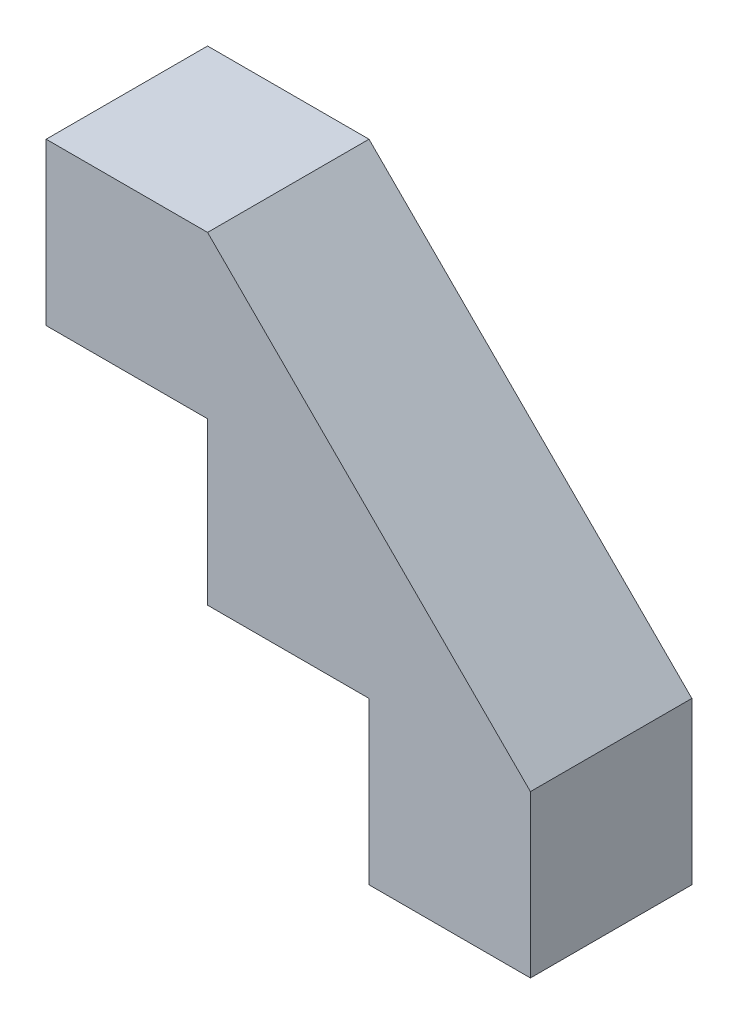
ISO-10303-21;
HEADER;
FILE_DESCRIPTION(('STEP AP214'),'2;1');
FILE_NAME('part.step','',(''),(''),'','','');
FILE_SCHEMA(('AUTOMOTIVE_DESIGN { 1 0 10303 214 1 1 1 1 }'));
ENDSEC;
DATA;
#1=APPLICATION_CONTEXT('core data for automotive mechanical design processes');
#2=APPLICATION_PROTOCOL_DEFINITION('international standard','automotive_design',2000,#1);
#3=PRODUCT_CONTEXT('',#1,'mechanical');
#4=PRODUCT('Part','Part','',(#3));
#5=PRODUCT_RELATED_PRODUCT_CATEGORY('part','',(#4));
#6=PRODUCT_DEFINITION_FORMATION('','',#4);
#7=PRODUCT_DEFINITION_CONTEXT('part definition',#1,'design');
#8=PRODUCT_DEFINITION('design','',#6,#7);
#9=PRODUCT_DEFINITION_SHAPE('','',#8);
#10=(LENGTH_UNIT() NAMED_UNIT(*) SI_UNIT(.MILLI.,.METRE.));
#11=(NAMED_UNIT(*) PLANE_ANGLE_UNIT() SI_UNIT($,.RADIAN.));
#12=(NAMED_UNIT(*) SI_UNIT($,.STERADIAN.) SOLID_ANGLE_UNIT());
#13=UNCERTAINTY_MEASURE_WITH_UNIT(LENGTH_MEASURE(1.E-05),#10,'distance_accuracy_value','');
#14=(GEOMETRIC_REPRESENTATION_CONTEXT(3) GLOBAL_UNCERTAINTY_ASSIGNED_CONTEXT((#13)) GLOBAL_UNIT_ASSIGNED_CONTEXT((#10,
#11,#12)) REPRESENTATION_CONTEXT('',''));
#15=CARTESIAN_POINT('',(0.,0.,0.));
#16=DIRECTION('',(0.,0.,1.));
#17=DIRECTION('',(1.,0.,0.));
#18=AXIS2_PLACEMENT_3D('',#15,#16,#17);
#19=CARTESIAN_POINT('',(0.,0.,3.));
#20=DIRECTION('',(0.,1.,0.));
#21=DIRECTION('',(-1.,0.,0.));
#22=AXIS2_PLACEMENT_3D('',#19,#20,#21);
#23=PLANE('',#22);
#24=DIRECTION('',(1.,0.,0.));
#25=VECTOR('',#24,1.);
#26=CARTESIAN_POINT('',(0.,0.,0.));
#27=LINE('',#26,#25);
#28=CARTESIAN_POINT('',(0.,0.,0.));
#29=VERTEX_POINT('',#28);
#30=CARTESIAN_POINT('',(3.,0.,0.));
#31=VERTEX_POINT('',#30);
#32=EDGE_CURVE('E134',#29,#31,#27,.T.);
#33=ORIENTED_EDGE('',*,*,#32,.T.);
#34=DIRECTION('',(0.,0.,-1.));
#35=VECTOR('',#34,1.);
#36=CARTESIAN_POINT('',(3.,0.,3.));
#37=LINE('',#36,#35);
#38=CARTESIAN_POINT('',(3.,0.,3.));
#39=VERTEX_POINT('',#38);
#40=EDGE_CURVE('E11',#39,#31,#37,.T.);
#41=ORIENTED_EDGE('',*,*,#40,.F.);
#42=DIRECTION('',(1.,0.,0.));
#43=VECTOR('',#42,1.);
#44=CARTESIAN_POINT('',(0.,0.,3.));
#45=LINE('',#44,#43);
#46=CARTESIAN_POINT('',(0.,0.,3.));
#47=VERTEX_POINT('',#46);
#48=EDGE_CURVE('E150',#47,#39,#45,.T.);
#49=ORIENTED_EDGE('',*,*,#48,.F.);
#50=DIRECTION('',(0.,0.,-1.));
#51=VECTOR('',#50,1.);
#52=CARTESIAN_POINT('',(0.,0.,3.));
#53=LINE('',#52,#51);
#54=EDGE_CURVE('E130',#47,#29,#53,.T.);
#55=ORIENTED_EDGE('',*,*,#54,.T.);
#56=EDGE_LOOP('',(#33,#41,#49,#55));
#57=FACE_BOUND('',#56,.T.);
#58=ADVANCED_FACE('F32',(#57),#23,.F.);
#59=CARTESIAN_POINT('',(3.,-3.,3.));
#60=DIRECTION('',(1.,0.,0.));
#61=DIRECTION('',(0.,0.,-1.));
#62=AXIS2_PLACEMENT_3D('',#59,#60,#61);
#63=PLANE('',#62);
#64=DIRECTION('',(0.,-1.,0.));
#65=VECTOR('',#64,1.);
#66=CARTESIAN_POINT('',(3.,-3.,0.));
#67=LINE('',#66,#65);
#68=CARTESIAN_POINT('',(3.,-3.,0.));
#69=VERTEX_POINT('',#68);
#70=EDGE_CURVE('E137',#31,#69,#67,.T.);
#71=ORIENTED_EDGE('',*,*,#70,.T.);
#72=DIRECTION('',(0.,0.,-1.));
#73=VECTOR('',#72,1.);
#74=CARTESIAN_POINT('',(3.,-3.,3.));
#75=LINE('',#74,#73);
#76=CARTESIAN_POINT('',(3.,-3.,3.));
#77=VERTEX_POINT('',#76);
#78=EDGE_CURVE('E40',#77,#69,#75,.T.);
#79=ORIENTED_EDGE('',*,*,#78,.F.);
#80=DIRECTION('',(0.,-1.,0.));
#81=VECTOR('',#80,1.);
#82=CARTESIAN_POINT('',(3.,-3.,3.));
#83=LINE('',#82,#81);
#84=EDGE_CURVE('E94',#39,#77,#83,.T.);
#85=ORIENTED_EDGE('',*,*,#84,.F.);
#86=ORIENTED_EDGE('',*,*,#40,.T.);
#87=EDGE_LOOP('',(#71,#79,#85,#86));
#88=FACE_BOUND('',#87,.T.);
#89=ADVANCED_FACE('F193',(#88),#63,.F.);
#90=CARTESIAN_POINT('',(6.,-3.,3.));
#91=DIRECTION('',(0.,1.,0.));
#92=DIRECTION('',(-1.,0.,0.));
#93=AXIS2_PLACEMENT_3D('',#90,#91,#92);
#94=PLANE('',#93);
#95=DIRECTION('',(1.,0.,0.));
#96=VECTOR('',#95,1.);
#97=CARTESIAN_POINT('',(6.,-3.,0.));
#98=LINE('',#97,#96);
#99=CARTESIAN_POINT('',(6.,-3.,0.));
#100=VERTEX_POINT('',#99);
#101=EDGE_CURVE('E139',#69,#100,#98,.T.);
#102=ORIENTED_EDGE('',*,*,#101,.T.);
#103=DIRECTION('',(0.,0.,-1.));
#104=VECTOR('',#103,1.);
#105=CARTESIAN_POINT('',(6.,-3.,3.));
#106=LINE('',#105,#104);
#107=CARTESIAN_POINT('',(6.,-3.,3.));
#108=VERTEX_POINT('',#107);
#109=EDGE_CURVE('E160',#108,#100,#106,.T.);
#110=ORIENTED_EDGE('',*,*,#109,.F.);
#111=DIRECTION('',(1.,0.,0.));
#112=VECTOR('',#111,1.);
#113=CARTESIAN_POINT('',(6.,-3.,3.));
#114=LINE('',#113,#112);
#115=EDGE_CURVE('E168',#77,#108,#114,.T.);
#116=ORIENTED_EDGE('',*,*,#115,.F.);
#117=ORIENTED_EDGE('',*,*,#78,.T.);
#118=EDGE_LOOP('',(#102,#110,#116,#117));
#119=FACE_BOUND('',#118,.T.);
#120=ADVANCED_FACE('F166',(#119),#94,.F.);
#121=CARTESIAN_POINT('',(6.,0.,3.));
#122=DIRECTION('',(-1.,0.,0.));
#123=DIRECTION('',(0.,-1.,0.));
#124=AXIS2_PLACEMENT_3D('',#121,#122,#123);
#125=PLANE('',#124);
#126=DIRECTION('',(0.,1.,0.));
#127=VECTOR('',#126,1.);
#128=CARTESIAN_POINT('',(6.,0.,0.));
#129=LINE('',#128,#127);
#130=CARTESIAN_POINT('',(6.,0.,0.));
#131=VERTEX_POINT('',#130);
#132=EDGE_CURVE('E141',#100,#131,#129,.T.);
#133=ORIENTED_EDGE('',*,*,#132,.T.);
#134=DIRECTION('',(0.,0.,-1.));
#135=VECTOR('',#134,1.);
#136=CARTESIAN_POINT('',(6.,0.,3.));
#137=LINE('',#136,#135);
#138=CARTESIAN_POINT('',(6.,0.,3.));
#139=VERTEX_POINT('',#138);
#140=EDGE_CURVE('E157',#139,#131,#137,.T.);
#141=ORIENTED_EDGE('',*,*,#140,.F.);
#142=DIRECTION('',(0.,1.,0.));
#143=VECTOR('',#142,1.);
#144=CARTESIAN_POINT('',(6.,0.,3.));
#145=LINE('',#144,#143);
#146=EDGE_CURVE('E184',#108,#139,#145,.T.);
#147=ORIENTED_EDGE('',*,*,#146,.F.);
#148=ORIENTED_EDGE('',*,*,#109,.T.);
#149=EDGE_LOOP('',(#133,#141,#147,#148));
#150=FACE_BOUND('',#149,.T.);
#151=ADVANCED_FACE('F177',(#150),#125,.F.);
#152=CARTESIAN_POINT('',(0.,6.,3.));
#153=DIRECTION('',(-0.70710678118655,-0.707106781186544,0.));
#154=DIRECTION('',(0.707106781186545,-0.707106781186551,0.));
#155=AXIS2_PLACEMENT_3D('',#152,#153,#154);
#156=PLANE('',#155);
#157=DIRECTION('',(-0.707106781186544,0.707106781186551,0.));
#158=VECTOR('',#157,1.);
#159=CARTESIAN_POINT('',(0.,6.,0.));
#160=LINE('',#159,#158);
#161=CARTESIAN_POINT('',(0.,6.,0.));
#162=VERTEX_POINT('',#161);
#163=EDGE_CURVE('E143',#131,#162,#160,.T.);
#164=ORIENTED_EDGE('',*,*,#163,.T.);
#165=DIRECTION('',(0.,0.,-1.));
#166=VECTOR('',#165,1.);
#167=CARTESIAN_POINT('',(0.,6.,3.));
#168=LINE('',#167,#166);
#169=CARTESIAN_POINT('',(0.,6.,3.));
#170=VERTEX_POINT('',#169);
#171=EDGE_CURVE('E154',#170,#162,#168,.T.);
#172=ORIENTED_EDGE('',*,*,#171,.F.);
#173=DIRECTION('',(-0.707106781186544,0.707106781186551,0.));
#174=VECTOR('',#173,1.);
#175=CARTESIAN_POINT('',(0.,6.,3.));
#176=LINE('',#175,#174);
#177=EDGE_CURVE('E183',#139,#170,#176,.T.);
#178=ORIENTED_EDGE('',*,*,#177,.F.);
#179=ORIENTED_EDGE('',*,*,#140,.T.);
#180=EDGE_LOOP('',(#164,#172,#178,#179));
#181=FACE_BOUND('',#180,.T.);
#182=ADVANCED_FACE('F181',(#181),#156,.F.);
#183=CARTESIAN_POINT('',(0.,6.,3.));
#184=DIRECTION('',(0.,-1.,0.));
#185=DIRECTION('',(1.,0.,0.));
#186=AXIS2_PLACEMENT_3D('',#183,#184,#185);
#187=PLANE('',#186);
#188=DIRECTION('',(-1.,0.,0.));
#189=VECTOR('',#188,1.);
#190=CARTESIAN_POINT('',(0.,6.,0.));
#191=LINE('',#190,#189);
#192=CARTESIAN_POINT('',(-3.,6.,0.));
#193=VERTEX_POINT('',#192);
#194=EDGE_CURVE('E145',#162,#193,#191,.T.);
#195=ORIENTED_EDGE('',*,*,#194,.T.);
#196=DIRECTION('',(0.,0.,-1.));
#197=VECTOR('',#196,1.);
#198=CARTESIAN_POINT('',(-3.,6.,3.));
#199=LINE('',#198,#197);
#200=CARTESIAN_POINT('',(-3.,6.,3.));
#201=VERTEX_POINT('',#200);
#202=EDGE_CURVE('E125',#201,#193,#199,.T.);
#203=ORIENTED_EDGE('',*,*,#202,.F.);
#204=DIRECTION('',(-1.,0.,0.));
#205=VECTOR('',#204,1.);
#206=CARTESIAN_POINT('',(0.,6.,3.));
#207=LINE('',#206,#205);
#208=EDGE_CURVE('E116',#170,#201,#207,.T.);
#209=ORIENTED_EDGE('',*,*,#208,.F.);
#210=ORIENTED_EDGE('',*,*,#171,.T.);
#211=EDGE_LOOP('',(#195,#203,#209,#210));
#212=FACE_BOUND('',#211,.T.);
#213=ADVANCED_FACE('F205',(#212),#187,.F.);
#214=CARTESIAN_POINT('',(-3.,6.,3.));
#215=DIRECTION('',(1.,0.,0.));
#216=DIRECTION('',(0.,1.,0.));
#217=AXIS2_PLACEMENT_3D('',#214,#215,#216);
#218=PLANE('',#217);
#219=DIRECTION('',(0.,-1.,0.));
#220=VECTOR('',#219,1.);
#221=CARTESIAN_POINT('',(-3.,6.,0.));
#222=LINE('',#221,#220);
#223=CARTESIAN_POINT('',(-3.,3.,0.));
#224=VERTEX_POINT('',#223);
#225=EDGE_CURVE('E124',#193,#224,#222,.T.);
#226=ORIENTED_EDGE('',*,*,#225,.T.);
#227=DIRECTION('',(0.,0.,-1.));
#228=VECTOR('',#227,1.);
#229=CARTESIAN_POINT('',(-3.,3.,3.));
#230=LINE('',#229,#228);
#231=CARTESIAN_POINT('',(-3.,3.,3.));
#232=VERTEX_POINT('',#231);
#233=EDGE_CURVE('E121',#232,#224,#230,.T.);
#234=ORIENTED_EDGE('',*,*,#233,.F.);
#235=DIRECTION('',(0.,-1.,0.));
#236=VECTOR('',#235,1.);
#237=CARTESIAN_POINT('',(-3.,6.,3.));
#238=LINE('',#237,#236);
#239=EDGE_CURVE('E110',#201,#232,#238,.T.);
#240=ORIENTED_EDGE('',*,*,#239,.F.);
#241=ORIENTED_EDGE('',*,*,#202,.T.);
#242=EDGE_LOOP('',(#226,#234,#240,#241));
#243=FACE_BOUND('',#242,.T.);
#244=ADVANCED_FACE('F122',(#243),#218,.F.);
#245=CARTESIAN_POINT('',(-3.,3.,3.));
#246=DIRECTION('',(0.,1.,0.));
#247=DIRECTION('',(0.,0.,1.));
#248=AXIS2_PLACEMENT_3D('',#245,#246,#247);
#249=PLANE('',#248);
#250=DIRECTION('',(1.,0.,0.));
#251=VECTOR('',#250,1.);
#252=CARTESIAN_POINT('',(-3.,3.,0.));
#253=LINE('',#252,#251);
#254=CARTESIAN_POINT('',(0.,3.,0.));
#255=VERTEX_POINT('',#254);
#256=EDGE_CURVE('E80',#224,#255,#253,.T.);
#257=ORIENTED_EDGE('',*,*,#256,.T.);
#258=DIRECTION('',(0.,0.,-1.));
#259=VECTOR('',#258,1.);
#260=CARTESIAN_POINT('',(0.,3.,3.));
#261=LINE('',#260,#259);
#262=CARTESIAN_POINT('',(0.,3.,3.));
#263=VERTEX_POINT('',#262);
#264=EDGE_CURVE('E126',#263,#255,#261,.T.);
#265=ORIENTED_EDGE('',*,*,#264,.F.);
#266=DIRECTION('',(1.,0.,0.));
#267=VECTOR('',#266,1.);
#268=CARTESIAN_POINT('',(-3.,3.,3.));
#269=LINE('',#268,#267);
#270=EDGE_CURVE('E114',#232,#263,#269,.T.);
#271=ORIENTED_EDGE('',*,*,#270,.F.);
#272=ORIENTED_EDGE('',*,*,#233,.T.);
#273=EDGE_LOOP('',(#257,#265,#271,#272));
#274=FACE_BOUND('',#273,.T.);
#275=ADVANCED_FACE('F128',(#274),#249,.F.);
#276=CARTESIAN_POINT('',(0.,0.,3.));
#277=DIRECTION('',(1.,0.,0.));
#278=DIRECTION('',(0.,0.,-1.));
#279=AXIS2_PLACEMENT_3D('',#276,#277,#278);
#280=PLANE('',#279);
#281=DIRECTION('',(0.,-1.,0.));
#282=VECTOR('',#281,1.);
#283=CARTESIAN_POINT('',(0.,0.,0.));
#284=LINE('',#283,#282);
#285=EDGE_CURVE('E86',#255,#29,#284,.T.);
#286=ORIENTED_EDGE('',*,*,#285,.T.);
#287=ORIENTED_EDGE('',*,*,#54,.F.);
#288=DIRECTION('',(0.,-1.,0.));
#289=VECTOR('',#288,1.);
#290=CARTESIAN_POINT('',(0.,0.,3.));
#291=LINE('',#290,#289);
#292=EDGE_CURVE('E48',#263,#47,#291,.T.);
#293=ORIENTED_EDGE('',*,*,#292,.F.);
#294=ORIENTED_EDGE('',*,*,#264,.T.);
#295=EDGE_LOOP('',(#286,#287,#293,#294));
#296=FACE_BOUND('',#295,.T.);
#297=ADVANCED_FACE('F213',(#296),#280,.F.);
#298=CARTESIAN_POINT('',(0.,0.,3.));
#299=DIRECTION('',(0.,0.,1.));
#300=DIRECTION('',(1.,0.,0.));
#301=AXIS2_PLACEMENT_3D('',#298,#299,#300);
#302=PLANE('',#301);
#303=ORIENTED_EDGE('',*,*,#48,.T.);
#304=ORIENTED_EDGE('',*,*,#84,.T.);
#305=ORIENTED_EDGE('',*,*,#115,.T.);
#306=ORIENTED_EDGE('',*,*,#146,.T.);
#307=ORIENTED_EDGE('',*,*,#177,.T.);
#308=ORIENTED_EDGE('',*,*,#208,.T.);
#309=ORIENTED_EDGE('',*,*,#239,.T.);
#310=ORIENTED_EDGE('',*,*,#270,.T.);
#311=ORIENTED_EDGE('',*,*,#292,.T.);
#312=EDGE_LOOP('',(#303,#304,#305,#306,#307,#308,#309,#310,#311));
#313=FACE_BOUND('',#312,.T.);
#314=ADVANCED_FACE('F112',(#313),#302,.T.);
#315=CARTESIAN_POINT('',(0.,0.,0.));
#316=DIRECTION('',(0.,0.,1.));
#317=DIRECTION('',(1.,0.,0.));
#318=AXIS2_PLACEMENT_3D('',#315,#316,#317);
#319=PLANE('',#318);
#320=ORIENTED_EDGE('',*,*,#32,.F.);
#321=ORIENTED_EDGE('',*,*,#285,.F.);
#322=ORIENTED_EDGE('',*,*,#256,.F.);
#323=ORIENTED_EDGE('',*,*,#225,.F.);
#324=ORIENTED_EDGE('',*,*,#194,.F.);
#325=ORIENTED_EDGE('',*,*,#163,.F.);
#326=ORIENTED_EDGE('',*,*,#132,.F.);
#327=ORIENTED_EDGE('',*,*,#101,.F.);
#328=ORIENTED_EDGE('',*,*,#70,.F.);
#329=EDGE_LOOP('',(#320,#321,#322,#323,#324,#325,#326,#327,#328));
#330=FACE_BOUND('',#329,.T.);
#331=ADVANCED_FACE('F172',(#330),#319,.F.);
#332=CLOSED_SHELL('',(#58,#89,#120,#151,#182,#213,#244,#275,#297,#314,#331));
#333=MANIFOLD_SOLID_BREP('B2',#332);
#334=ADVANCED_BREP_SHAPE_REPRESENTATION('',(#18,#333),#14);
#335=SHAPE_DEFINITION_REPRESENTATION(#9,#334);
ENDSEC;
END-ISO-10303-21;
